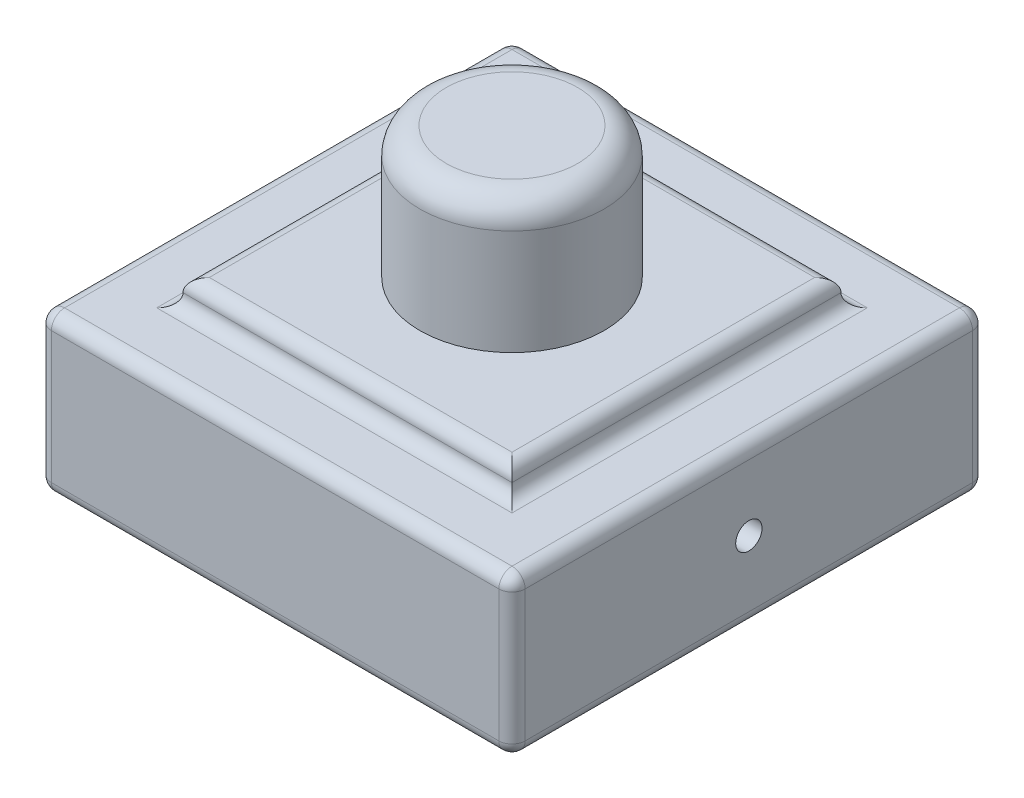
ISO-10303-21;
HEADER;
FILE_DESCRIPTION(('STEP AP214'),'2;1');
FILE_NAME('part.step','',(''),(''),'','','');
FILE_SCHEMA(('AUTOMOTIVE_DESIGN { 1 0 10303 214 1 1 1 1 }'));
ENDSEC;
DATA;
#1=APPLICATION_CONTEXT('core data for automotive mechanical design processes');
#2=APPLICATION_PROTOCOL_DEFINITION('international standard','automotive_design',2000,#1);
#3=PRODUCT_CONTEXT('',#1,'mechanical');
#4=PRODUCT('Part','Part','',(#3));
#5=PRODUCT_RELATED_PRODUCT_CATEGORY('part','',(#4));
#6=PRODUCT_DEFINITION_FORMATION('','',#4);
#7=PRODUCT_DEFINITION_CONTEXT('part definition',#1,'design');
#8=PRODUCT_DEFINITION('design','',#6,#7);
#9=PRODUCT_DEFINITION_SHAPE('','',#8);
#10=(LENGTH_UNIT() NAMED_UNIT(*) SI_UNIT(.MILLI.,.METRE.));
#11=(NAMED_UNIT(*) PLANE_ANGLE_UNIT() SI_UNIT($,.RADIAN.));
#12=(NAMED_UNIT(*) SI_UNIT($,.STERADIAN.) SOLID_ANGLE_UNIT());
#13=UNCERTAINTY_MEASURE_WITH_UNIT(LENGTH_MEASURE(1.E-05),#10,'distance_accuracy_value','');
#14=(GEOMETRIC_REPRESENTATION_CONTEXT(3) GLOBAL_UNCERTAINTY_ASSIGNED_CONTEXT((#13)) GLOBAL_UNIT_ASSIGNED_CONTEXT((#10,
#11,#12)) REPRESENTATION_CONTEXT('',''));
#15=CARTESIAN_POINT('',(0.,0.,0.));
#16=DIRECTION('',(0.,0.,1.));
#17=DIRECTION('',(1.,0.,0.));
#18=AXIS2_PLACEMENT_3D('',#15,#16,#17);
#19=CARTESIAN_POINT('',(18.,12.,-18.));
#20=DIRECTION('',(-1.,0.,0.));
#21=DIRECTION('',(0.,0.,1.));
#22=AXIS2_PLACEMENT_3D('',#19,#20,#21);
#23=PLANE('',#22);
#24=CARTESIAN_POINT('',(18.,6.,0.));
#25=DIRECTION('',(1.,0.,0.));
#26=DIRECTION('',(0.,0.,-1.));
#27=AXIS2_PLACEMENT_3D('',#24,#25,#26);
#28=CIRCLE('',#27,1.);
#29=CARTESIAN_POINT('',(18.,6.,-1.));
#30=VERTEX_POINT('',#29);
#31=EDGE_CURVE('E843',#30,#30,#28,.T.);
#32=ORIENTED_EDGE('',*,*,#31,.F.);
#33=EDGE_LOOP('',(#32));
#34=FACE_BOUND('',#33,.T.);
#35=DIRECTION('',(0.,0.,-1.));
#36=VECTOR('',#35,1.);
#37=CARTESIAN_POINT('',(18.,11.,18.));
#38=LINE('',#37,#36);
#39=CARTESIAN_POINT('',(18.,11.,-17.));
#40=VERTEX_POINT('',#39);
#41=CARTESIAN_POINT('',(18.,11.,17.));
#42=VERTEX_POINT('',#41);
#43=EDGE_CURVE('E288',#40,#42,#38,.F.);
#44=ORIENTED_EDGE('',*,*,#43,.T.);
#45=DIRECTION('',(0.,-1.,0.));
#46=VECTOR('',#45,1.);
#47=CARTESIAN_POINT('',(18.,12.,17.));
#48=LINE('',#47,#46);
#49=CARTESIAN_POINT('',(18.,1.,17.));
#50=VERTEX_POINT('',#49);
#51=EDGE_CURVE('E291',#42,#50,#48,.T.);
#52=ORIENTED_EDGE('',*,*,#51,.T.);
#53=DIRECTION('',(0.,0.,-1.));
#54=VECTOR('',#53,1.);
#55=CARTESIAN_POINT('',(18.,1.,-18.));
#56=LINE('',#55,#54);
#57=CARTESIAN_POINT('',(18.,1.,-17.));
#58=VERTEX_POINT('',#57);
#59=EDGE_CURVE('E285',#50,#58,#56,.T.);
#60=ORIENTED_EDGE('',*,*,#59,.T.);
#61=DIRECTION('',(0.,-1.,0.));
#62=VECTOR('',#61,1.);
#63=CARTESIAN_POINT('',(18.,12.,-17.));
#64=LINE('',#63,#62);
#65=EDGE_CURVE('E282',#58,#40,#64,.F.);
#66=ORIENTED_EDGE('',*,*,#65,.T.);
#67=EDGE_LOOP('',(#44,#52,#60,#66));
#68=FACE_BOUND('',#67,.T.);
#69=ADVANCED_FACE('F39',(#34,#68),#23,.F.);
#70=CARTESIAN_POINT('',(-18.,12.,-18.));
#71=DIRECTION('',(0.,0.,1.));
#72=DIRECTION('',(1.,0.,0.));
#73=AXIS2_PLACEMENT_3D('',#70,#71,#72);
#74=PLANE('',#73);
#75=DIRECTION('',(0.,-1.,0.));
#76=VECTOR('',#75,1.);
#77=CARTESIAN_POINT('',(-17.,12.,-18.));
#78=LINE('',#77,#76);
#79=CARTESIAN_POINT('',(-17.,1.,-18.));
#80=VERTEX_POINT('',#79);
#81=CARTESIAN_POINT('',(-17.,11.,-18.));
#82=VERTEX_POINT('',#81);
#83=EDGE_CURVE('E49',#80,#82,#78,.F.);
#84=ORIENTED_EDGE('',*,*,#83,.T.);
#85=DIRECTION('',(-1.,0.,0.));
#86=VECTOR('',#85,1.);
#87=CARTESIAN_POINT('',(18.,11.,-18.));
#88=LINE('',#87,#86);
#89=CARTESIAN_POINT('',(17.,11.,-18.));
#90=VERTEX_POINT('',#89);
#91=EDGE_CURVE('E11',#82,#90,#88,.F.);
#92=ORIENTED_EDGE('',*,*,#91,.T.);
#93=DIRECTION('',(0.,-1.,0.));
#94=VECTOR('',#93,1.);
#95=CARTESIAN_POINT('',(17.,12.,-18.));
#96=LINE('',#95,#94);
#97=CARTESIAN_POINT('',(17.,1.,-18.));
#98=VERTEX_POINT('',#97);
#99=EDGE_CURVE('E321',#90,#98,#96,.T.);
#100=ORIENTED_EDGE('',*,*,#99,.T.);
#101=DIRECTION('',(-1.,0.,0.));
#102=VECTOR('',#101,1.);
#103=CARTESIAN_POINT('',(-18.,1.,-18.));
#104=LINE('',#103,#102);
#105=EDGE_CURVE('E60',#98,#80,#104,.T.);
#106=ORIENTED_EDGE('',*,*,#105,.T.);
#107=EDGE_LOOP('',(#84,#92,#100,#106));
#108=FACE_BOUND('',#107,.T.);
#109=ADVANCED_FACE('F427',(#108),#74,.F.);
#110=CARTESIAN_POINT('',(-18.,12.,-18.));
#111=DIRECTION('',(1.,0.,0.));
#112=DIRECTION('',(0.,0.,-1.));
#113=AXIS2_PLACEMENT_3D('',#110,#111,#112);
#114=PLANE('',#113);
#115=CARTESIAN_POINT('',(-18.,6.,0.));
#116=DIRECTION('',(1.,0.,0.));
#117=DIRECTION('',(0.,0.,-1.));
#118=AXIS2_PLACEMENT_3D('',#115,#116,#117);
#119=CIRCLE('',#118,1.);
#120=CARTESIAN_POINT('',(-18.,6.,-1.));
#121=VERTEX_POINT('',#120);
#122=EDGE_CURVE('E43',#121,#121,#119,.T.);
#123=ORIENTED_EDGE('',*,*,#122,.T.);
#124=EDGE_LOOP('',(#123));
#125=FACE_BOUND('',#124,.T.);
#126=DIRECTION('',(0.,0.,1.));
#127=VECTOR('',#126,1.);
#128=CARTESIAN_POINT('',(-18.,1.,-18.));
#129=LINE('',#128,#127);
#130=CARTESIAN_POINT('',(-18.,1.,-17.));
#131=VERTEX_POINT('',#130);
#132=CARTESIAN_POINT('',(-18.,1.,17.));
#133=VERTEX_POINT('',#132);
#134=EDGE_CURVE('E272',#131,#133,#129,.T.);
#135=ORIENTED_EDGE('',*,*,#134,.T.);
#136=DIRECTION('',(0.,-1.,0.));
#137=VECTOR('',#136,1.);
#138=CARTESIAN_POINT('',(-18.,12.,17.));
#139=LINE('',#138,#137);
#140=CARTESIAN_POINT('',(-18.,11.,17.));
#141=VERTEX_POINT('',#140);
#142=EDGE_CURVE('E278',#133,#141,#139,.F.);
#143=ORIENTED_EDGE('',*,*,#142,.T.);
#144=DIRECTION('',(0.,0.,1.));
#145=VECTOR('',#144,1.);
#146=CARTESIAN_POINT('',(-18.,11.,-18.));
#147=LINE('',#146,#145);
#148=CARTESIAN_POINT('',(-18.,11.,-17.));
#149=VERTEX_POINT('',#148);
#150=EDGE_CURVE('E275',#141,#149,#147,.F.);
#151=ORIENTED_EDGE('',*,*,#150,.T.);
#152=DIRECTION('',(0.,-1.,0.));
#153=VECTOR('',#152,1.);
#154=CARTESIAN_POINT('',(-18.,12.,-17.));
#155=LINE('',#154,#153);
#156=EDGE_CURVE('E269',#149,#131,#155,.T.);
#157=ORIENTED_EDGE('',*,*,#156,.T.);
#158=EDGE_LOOP('',(#135,#143,#151,#157));
#159=FACE_BOUND('',#158,.T.);
#160=ADVANCED_FACE('F489',(#125,#159),#114,.F.);
#161=CARTESIAN_POINT('',(-18.,12.,18.));
#162=DIRECTION('',(0.,0.,-1.));
#163=DIRECTION('',(-1.,0.,0.));
#164=AXIS2_PLACEMENT_3D('',#161,#162,#163);
#165=PLANE('',#164);
#166=DIRECTION('',(0.,-1.,0.));
#167=VECTOR('',#166,1.);
#168=CARTESIAN_POINT('',(-17.,12.,18.));
#169=LINE('',#168,#167);
#170=CARTESIAN_POINT('',(-17.,11.,18.));
#171=VERTEX_POINT('',#170);
#172=CARTESIAN_POINT('',(-17.,1.,18.));
#173=VERTEX_POINT('',#172);
#174=EDGE_CURVE('E262',#171,#173,#169,.T.);
#175=ORIENTED_EDGE('',*,*,#174,.T.);
#176=DIRECTION('',(1.,0.,0.));
#177=VECTOR('',#176,1.);
#178=CARTESIAN_POINT('',(-18.,1.,18.));
#179=LINE('',#178,#177);
#180=CARTESIAN_POINT('',(17.,1.,18.));
#181=VERTEX_POINT('',#180);
#182=EDGE_CURVE('E266',#173,#181,#179,.T.);
#183=ORIENTED_EDGE('',*,*,#182,.T.);
#184=DIRECTION('',(0.,-1.,0.));
#185=VECTOR('',#184,1.);
#186=CARTESIAN_POINT('',(17.,12.,18.));
#187=LINE('',#186,#185);
#188=CARTESIAN_POINT('',(17.,11.,18.));
#189=VERTEX_POINT('',#188);
#190=EDGE_CURVE('E259',#181,#189,#187,.F.);
#191=ORIENTED_EDGE('',*,*,#190,.T.);
#192=DIRECTION('',(1.,0.,0.));
#193=VECTOR('',#192,1.);
#194=CARTESIAN_POINT('',(-18.,11.,18.));
#195=LINE('',#194,#193);
#196=EDGE_CURVE('E221',#189,#171,#195,.F.);
#197=ORIENTED_EDGE('',*,*,#196,.T.);
#198=EDGE_LOOP('',(#175,#183,#191,#197));
#199=FACE_BOUND('',#198,.T.);
#200=ADVANCED_FACE('F502',(#199),#165,.F.);
#201=CARTESIAN_POINT('',(0.,12.,0.));
#202=DIRECTION('',(0.,1.,0.));
#203=DIRECTION('',(0.,0.,1.));
#204=AXIS2_PLACEMENT_3D('',#201,#202,#203);
#205=PLANE('',#204);
#206=DIRECTION('',(0.,0.,1.));
#207=VECTOR('',#206,1.);
#208=CARTESIAN_POINT('',(-17.,12.,18.));
#209=LINE('',#208,#207);
#210=CARTESIAN_POINT('',(-17.,12.,-17.));
#211=VERTEX_POINT('',#210);
#212=CARTESIAN_POINT('',(-17.,12.,17.));
#213=VERTEX_POINT('',#212);
#214=EDGE_CURVE('E314',#211,#213,#209,.T.);
#215=ORIENTED_EDGE('',*,*,#214,.T.);
#216=DIRECTION('',(1.,0.,0.));
#217=VECTOR('',#216,1.);
#218=CARTESIAN_POINT('',(18.,12.,17.));
#219=LINE('',#218,#217);
#220=CARTESIAN_POINT('',(17.,12.,17.));
#221=VERTEX_POINT('',#220);
#222=EDGE_CURVE('E317',#213,#221,#219,.T.);
#223=ORIENTED_EDGE('',*,*,#222,.T.);
#224=DIRECTION('',(0.,0.,-1.));
#225=VECTOR('',#224,1.);
#226=CARTESIAN_POINT('',(17.,12.,-18.));
#227=LINE('',#226,#225);
#228=CARTESIAN_POINT('',(17.,12.,-17.));
#229=VERTEX_POINT('',#228);
#230=EDGE_CURVE('E308',#221,#229,#227,.T.);
#231=ORIENTED_EDGE('',*,*,#230,.T.);
#232=DIRECTION('',(-1.,0.,0.));
#233=VECTOR('',#232,1.);
#234=CARTESIAN_POINT('',(-18.,12.,-17.));
#235=LINE('',#234,#233);
#236=EDGE_CURVE('E311',#229,#211,#235,.T.);
#237=ORIENTED_EDGE('',*,*,#236,.T.);
#238=EDGE_LOOP('',(#215,#223,#231,#237));
#239=FACE_BOUND('',#238,.T.);
#240=DIRECTION('',(0.,0.,1.));
#241=VECTOR('',#240,1.);
#242=CARTESIAN_POINT('',(-13.5,12.,0.));
#243=LINE('',#242,#241);
#244=CARTESIAN_POINT('',(-13.5,12.,13.5));
#245=VERTEX_POINT('',#244);
#246=CARTESIAN_POINT('',(-13.5,12.,-13.5));
#247=VERTEX_POINT('',#246);
#248=EDGE_CURVE('E168',#245,#247,#243,.F.);
#249=ORIENTED_EDGE('',*,*,#248,.T.);
#250=DIRECTION('',(-1.,0.,0.));
#251=VECTOR('',#250,1.);
#252=CARTESIAN_POINT('',(0.,12.,-13.5));
#253=LINE('',#252,#251);
#254=CARTESIAN_POINT('',(13.5,12.,-13.5));
#255=VERTEX_POINT('',#254);
#256=EDGE_CURVE('E205',#247,#255,#253,.F.);
#257=ORIENTED_EDGE('',*,*,#256,.T.);
#258=DIRECTION('',(0.,0.,-1.));
#259=VECTOR('',#258,1.);
#260=CARTESIAN_POINT('',(13.5,12.,0.));
#261=LINE('',#260,#259);
#262=CARTESIAN_POINT('',(13.5,12.,13.5));
#263=VERTEX_POINT('',#262);
#264=EDGE_CURVE('E171',#255,#263,#261,.F.);
#265=ORIENTED_EDGE('',*,*,#264,.T.);
#266=DIRECTION('',(1.,0.,0.));
#267=VECTOR('',#266,1.);
#268=CARTESIAN_POINT('',(0.,12.,13.5));
#269=LINE('',#268,#267);
#270=EDGE_CURVE('E163',#263,#245,#269,.F.);
#271=ORIENTED_EDGE('',*,*,#270,.T.);
#272=EDGE_LOOP('',(#249,#257,#265,#271));
#273=FACE_BOUND('',#272,.T.);
#274=ADVANCED_FACE('F165',(#239,#273),#205,.T.);
#275=CARTESIAN_POINT('',(0.,0.,0.));
#276=DIRECTION('',(0.,1.,0.));
#277=DIRECTION('',(0.,0.,1.));
#278=AXIS2_PLACEMENT_3D('',#275,#276,#277);
#279=PLANE('',#278);
#280=DIRECTION('',(0.,0.,-1.));
#281=VECTOR('',#280,1.);
#282=CARTESIAN_POINT('',(17.,0.,0.));
#283=LINE('',#282,#281);
#284=CARTESIAN_POINT('',(17.,0.,-17.));
#285=VERTEX_POINT('',#284);
#286=CARTESIAN_POINT('',(17.,0.,17.));
#287=VERTEX_POINT('',#286);
#288=EDGE_CURVE('E295',#285,#287,#283,.F.);
#289=ORIENTED_EDGE('',*,*,#288,.T.);
#290=DIRECTION('',(1.,0.,0.));
#291=VECTOR('',#290,1.);
#292=CARTESIAN_POINT('',(0.,0.,17.));
#293=LINE('',#292,#291);
#294=CARTESIAN_POINT('',(-17.,0.,17.));
#295=VERTEX_POINT('',#294);
#296=EDGE_CURVE('E304',#287,#295,#293,.F.);
#297=ORIENTED_EDGE('',*,*,#296,.T.);
#298=DIRECTION('',(0.,0.,1.));
#299=VECTOR('',#298,1.);
#300=CARTESIAN_POINT('',(-17.,0.,0.));
#301=LINE('',#300,#299);
#302=CARTESIAN_POINT('',(-17.,0.,-17.));
#303=VERTEX_POINT('',#302);
#304=EDGE_CURVE('E301',#295,#303,#301,.F.);
#305=ORIENTED_EDGE('',*,*,#304,.T.);
#306=DIRECTION('',(-1.,0.,0.));
#307=VECTOR('',#306,1.);
#308=CARTESIAN_POINT('',(0.,0.,-17.));
#309=LINE('',#308,#307);
#310=EDGE_CURVE('E298',#303,#285,#309,.F.);
#311=ORIENTED_EDGE('',*,*,#310,.T.);
#312=EDGE_LOOP('',(#289,#297,#305,#311));
#313=FACE_BOUND('',#312,.T.);
#314=ADVANCED_FACE('F509',(#313),#279,.F.);
#315=CARTESIAN_POINT('',(0.,14.,0.));
#316=DIRECTION('',(0.,1.,0.));
#317=DIRECTION('',(0.,0.,1.));
#318=AXIS2_PLACEMENT_3D('',#315,#316,#317);
#319=PLANE('',#318);
#320=DIRECTION('',(-1.,0.,0.));
#321=VECTOR('',#320,1.);
#322=CARTESIAN_POINT('',(-12.5,14.,-11.5));
#323=LINE('',#322,#321);
#324=CARTESIAN_POINT('',(11.5,14.,-11.5));
#325=VERTEX_POINT('',#324);
#326=CARTESIAN_POINT('',(-11.5,14.,-11.5));
#327=VERTEX_POINT('',#326);
#328=EDGE_CURVE('E208',#325,#327,#323,.T.);
#329=ORIENTED_EDGE('',*,*,#328,.T.);
#330=DIRECTION('',(0.,0.,1.));
#331=VECTOR('',#330,1.);
#332=CARTESIAN_POINT('',(-11.5,14.,12.5));
#333=LINE('',#332,#331);
#334=CARTESIAN_POINT('',(-11.5,14.,11.5));
#335=VERTEX_POINT('',#334);
#336=EDGE_CURVE('E217',#327,#335,#333,.T.);
#337=ORIENTED_EDGE('',*,*,#336,.T.);
#338=DIRECTION('',(1.,0.,0.));
#339=VECTOR('',#338,1.);
#340=CARTESIAN_POINT('',(12.5,14.,11.5));
#341=LINE('',#340,#339);
#342=CARTESIAN_POINT('',(11.5,14.,11.5));
#343=VERTEX_POINT('',#342);
#344=EDGE_CURVE('E214',#335,#343,#341,.T.);
#345=ORIENTED_EDGE('',*,*,#344,.T.);
#346=DIRECTION('',(0.,0.,-1.));
#347=VECTOR('',#346,1.);
#348=CARTESIAN_POINT('',(11.5,14.,-12.5));
#349=LINE('',#348,#347);
#350=EDGE_CURVE('E211',#343,#325,#349,.T.);
#351=ORIENTED_EDGE('',*,*,#350,.T.);
#352=EDGE_LOOP('',(#329,#337,#345,#351));
#353=FACE_BOUND('',#352,.T.);
#354=CARTESIAN_POINT('',(0.,14.,0.));
#355=DIRECTION('',(0.,1.,0.));
#356=DIRECTION('',(0.,0.,1.));
#357=AXIS2_PLACEMENT_3D('',#354,#355,#356);
#358=CIRCLE('',#357,7.);
#359=CARTESIAN_POINT('',(0.,14.,7.));
#360=VERTEX_POINT('',#359);
#361=EDGE_CURVE('E256',#360,#360,#358,.T.);
#362=ORIENTED_EDGE('',*,*,#361,.F.);
#363=EDGE_LOOP('',(#362));
#364=FACE_BOUND('',#363,.T.);
#365=ADVANCED_FACE('F654',(#353,#364),#319,.T.);
#366=CARTESIAN_POINT('',(0.,24.,0.));
#367=DIRECTION('',(0.,-1.,0.));
#368=DIRECTION('',(0.,0.,-1.));
#369=AXIS2_PLACEMENT_3D('',#366,#367,#368);
#370=CYLINDRICAL_SURFACE('',#369,7.);
#371=CARTESIAN_POINT('',(0.,22.,0.));
#372=DIRECTION('',(0.,1.,0.));
#373=DIRECTION('',(0.,0.,1.));
#374=AXIS2_PLACEMENT_3D('',#371,#372,#373);
#375=CIRCLE('',#374,7.);
#376=CARTESIAN_POINT('',(0.,22.,7.));
#377=VERTEX_POINT('',#376);
#378=EDGE_CURVE('E195',#377,#377,#375,.F.);
#379=ORIENTED_EDGE('',*,*,#378,.T.);
#380=EDGE_LOOP('',(#379));
#381=FACE_BOUND('',#380,.T.);
#382=ORIENTED_EDGE('',*,*,#361,.T.);
#383=EDGE_LOOP('',(#382));
#384=FACE_BOUND('',#383,.T.);
#385=ADVANCED_FACE('F646',(#381,#384),#370,.T.);
#386=CARTESIAN_POINT('',(0.,24.,0.));
#387=DIRECTION('',(0.,1.,0.));
#388=DIRECTION('',(0.,0.,1.));
#389=AXIS2_PLACEMENT_3D('',#386,#387,#388);
#390=PLANE('',#389);
#391=CARTESIAN_POINT('',(0.,24.,0.));
#392=DIRECTION('',(0.,1.,0.));
#393=DIRECTION('',(0.,0.,1.));
#394=AXIS2_PLACEMENT_3D('',#391,#392,#393);
#395=CIRCLE('',#394,5.);
#396=CARTESIAN_POINT('',(0.,24.,5.));
#397=VERTEX_POINT('',#396);
#398=EDGE_CURVE('E199',#397,#397,#395,.T.);
#399=ORIENTED_EDGE('',*,*,#398,.T.);
#400=EDGE_LOOP('',(#399));
#401=FACE_BOUND('',#400,.T.);
#402=ADVANCED_FACE('F527',(#401),#390,.T.);
#403=CARTESIAN_POINT('',(0.,22.,0.));
#404=DIRECTION('',(0.,1.,0.));
#405=DIRECTION('',(0.,0.,1.));
#406=AXIS2_PLACEMENT_3D('',#403,#404,#405);
#407=TOROIDAL_SURFACE('',#406,5.,2.);
#408=ORIENTED_EDGE('',*,*,#378,.F.);
#409=EDGE_LOOP('',(#408));
#410=FACE_BOUND('',#409,.T.);
#411=ORIENTED_EDGE('',*,*,#398,.F.);
#412=EDGE_LOOP('',(#411));
#413=FACE_BOUND('',#412,.T.);
#414=ADVANCED_FACE('F523',(#410,#413),#407,.T.);
#415=CARTESIAN_POINT('',(0.,13.,11.5));
#416=DIRECTION('',(-1.,0.,0.));
#417=DIRECTION('',(0.,0.,1.));
#418=AXIS2_PLACEMENT_3D('',#415,#416,#417);
#419=CYLINDRICAL_SURFACE('',#418,1.);
#420=CARTESIAN_POINT('',(11.5,13.,11.5));
#421=DIRECTION('',(-0.707106781186547,0.,0.707106781186547));
#422=DIRECTION('',(0.707106781186547,0.,0.707106781186547));
#423=AXIS2_PLACEMENT_3D('',#420,#421,#422);
#424=ELLIPSE('',#423,1.41421356237309,1.);
#425=CARTESIAN_POINT('',(12.5,13.,12.5));
#426=VERTEX_POINT('',#425);
#427=EDGE_CURVE('E253',#343,#426,#424,.F.);
#428=ORIENTED_EDGE('',*,*,#427,.F.);
#429=ORIENTED_EDGE('',*,*,#344,.F.);
#430=CARTESIAN_POINT('',(-11.5,13.,11.5));
#431=DIRECTION('',(-0.707106781186547,0.,-0.707106781186547));
#432=DIRECTION('',(-0.707106781186547,0.,0.707106781186547));
#433=AXIS2_PLACEMENT_3D('',#430,#431,#432);
#434=ELLIPSE('',#433,1.41421356237309,1.);
#435=CARTESIAN_POINT('',(-12.5,13.,12.5));
#436=VERTEX_POINT('',#435);
#437=EDGE_CURVE('E250',#436,#335,#434,.T.);
#438=ORIENTED_EDGE('',*,*,#437,.F.);
#439=DIRECTION('',(1.,0.,0.));
#440=VECTOR('',#439,1.);
#441=CARTESIAN_POINT('',(-12.5,13.,12.5));
#442=LINE('',#441,#440);
#443=EDGE_CURVE('E182',#426,#436,#442,.F.);
#444=ORIENTED_EDGE('',*,*,#443,.F.);
#445=EDGE_LOOP('',(#428,#429,#438,#444));
#446=FACE_BOUND('',#445,.T.);
#447=ADVANCED_FACE('F526',(#446),#419,.T.);
#448=CARTESIAN_POINT('',(11.5,13.,0.));
#449=DIRECTION('',(0.,0.,1.));
#450=DIRECTION('',(1.,0.,0.));
#451=AXIS2_PLACEMENT_3D('',#448,#449,#450);
#452=CYLINDRICAL_SURFACE('',#451,1.);
#453=ORIENTED_EDGE('',*,*,#350,.F.);
#454=ORIENTED_EDGE('',*,*,#427,.T.);
#455=DIRECTION('',(0.,0.,-1.));
#456=VECTOR('',#455,1.);
#457=CARTESIAN_POINT('',(12.5,13.,12.5));
#458=LINE('',#457,#456);
#459=CARTESIAN_POINT('',(12.5,13.,-12.5));
#460=VERTEX_POINT('',#459);
#461=EDGE_CURVE('E241',#460,#426,#458,.F.);
#462=ORIENTED_EDGE('',*,*,#461,.F.);
#463=CARTESIAN_POINT('',(11.5,13.,-11.5));
#464=DIRECTION('',(0.707106781186547,0.,0.707106781186547));
#465=DIRECTION('',(0.707106781186547,0.,-0.707106781186547));
#466=AXIS2_PLACEMENT_3D('',#463,#464,#465);
#467=ELLIPSE('',#466,1.41421356237309,1.);
#468=EDGE_CURVE('E237',#325,#460,#467,.F.);
#469=ORIENTED_EDGE('',*,*,#468,.F.);
#470=EDGE_LOOP('',(#453,#454,#462,#469));
#471=FACE_BOUND('',#470,.T.);
#472=ADVANCED_FACE('F548',(#471),#452,.T.);
#473=CARTESIAN_POINT('',(-11.5,13.,0.));
#474=DIRECTION('',(0.,0.,-1.));
#475=DIRECTION('',(-1.,0.,0.));
#476=AXIS2_PLACEMENT_3D('',#473,#474,#475);
#477=CYLINDRICAL_SURFACE('',#476,1.);
#478=ORIENTED_EDGE('',*,*,#437,.T.);
#479=ORIENTED_EDGE('',*,*,#336,.F.);
#480=CARTESIAN_POINT('',(-11.5,13.,-11.5));
#481=DIRECTION('',(0.707106781186547,0.,-0.707106781186547));
#482=DIRECTION('',(0.707106781186547,0.,0.707106781186547));
#483=AXIS2_PLACEMENT_3D('',#480,#481,#482);
#484=ELLIPSE('',#483,1.41421356237309,1.);
#485=CARTESIAN_POINT('',(-12.5,13.,-12.5));
#486=VERTEX_POINT('',#485);
#487=EDGE_CURVE('E233',#486,#327,#484,.T.);
#488=ORIENTED_EDGE('',*,*,#487,.F.);
#489=DIRECTION('',(0.,0.,1.));
#490=VECTOR('',#489,1.);
#491=CARTESIAN_POINT('',(-12.5,13.,-12.5));
#492=LINE('',#491,#490);
#493=EDGE_CURVE('E187',#436,#486,#492,.F.);
#494=ORIENTED_EDGE('',*,*,#493,.F.);
#495=EDGE_LOOP('',(#478,#479,#488,#494));
#496=FACE_BOUND('',#495,.T.);
#497=ADVANCED_FACE('F545',(#496),#477,.T.);
#498=CARTESIAN_POINT('',(-12.5,13.,13.5));
#499=DIRECTION('',(1.,0.,0.));
#500=DIRECTION('',(0.,0.,-1.));
#501=AXIS2_PLACEMENT_3D('',#498,#499,#500);
#502=CYLINDRICAL_SURFACE('',#501,1.);
#503=CARTESIAN_POINT('',(-13.5,13.,13.5));
#504=DIRECTION('',(0.707106781186547,0.,0.707106781186547));
#505=DIRECTION('',(-0.707106781186547,0.,0.707106781186547));
#506=AXIS2_PLACEMENT_3D('',#503,#504,#505);
#507=ELLIPSE('',#506,1.41421356237309,1.);
#508=EDGE_CURVE('E179',#245,#436,#507,.T.);
#509=ORIENTED_EDGE('',*,*,#508,.F.);
#510=ORIENTED_EDGE('',*,*,#270,.F.);
#511=CARTESIAN_POINT('',(13.5,13.,13.5));
#512=DIRECTION('',(0.707106781186547,0.,-0.707106781186547));
#513=DIRECTION('',(0.707106781186547,0.,0.707106781186547));
#514=AXIS2_PLACEMENT_3D('',#511,#512,#513);
#515=ELLIPSE('',#514,1.41421356237309,1.);
#516=EDGE_CURVE('E245',#426,#263,#515,.F.);
#517=ORIENTED_EDGE('',*,*,#516,.F.);
#518=ORIENTED_EDGE('',*,*,#443,.T.);
#519=EDGE_LOOP('',(#509,#510,#517,#518));
#520=FACE_BOUND('',#519,.T.);
#521=ADVANCED_FACE('F180',(#520),#502,.F.);
#522=CARTESIAN_POINT('',(13.5,13.,-12.5));
#523=DIRECTION('',(0.,0.,-1.));
#524=DIRECTION('',(-1.,0.,0.));
#525=AXIS2_PLACEMENT_3D('',#522,#523,#524);
#526=CYLINDRICAL_SURFACE('',#525,1.);
#527=ORIENTED_EDGE('',*,*,#516,.T.);
#528=ORIENTED_EDGE('',*,*,#264,.F.);
#529=CARTESIAN_POINT('',(13.5,13.,-13.5));
#530=DIRECTION('',(-0.707106781186547,0.,-0.707106781186547));
#531=DIRECTION('',(0.707106781186547,0.,-0.707106781186547));
#532=AXIS2_PLACEMENT_3D('',#529,#530,#531);
#533=ELLIPSE('',#532,1.41421356237309,1.);
#534=EDGE_CURVE('E188',#460,#255,#533,.F.);
#535=ORIENTED_EDGE('',*,*,#534,.F.);
#536=ORIENTED_EDGE('',*,*,#461,.T.);
#537=EDGE_LOOP('',(#527,#528,#535,#536));
#538=FACE_BOUND('',#537,.T.);
#539=ADVANCED_FACE('F538',(#538),#526,.F.);
#540=CARTESIAN_POINT('',(0.,13.,-11.5));
#541=DIRECTION('',(1.,0.,0.));
#542=DIRECTION('',(0.,0.,-1.));
#543=AXIS2_PLACEMENT_3D('',#540,#541,#542);
#544=CYLINDRICAL_SURFACE('',#543,1.);
#545=ORIENTED_EDGE('',*,*,#328,.F.);
#546=ORIENTED_EDGE('',*,*,#468,.T.);
#547=DIRECTION('',(-1.,0.,0.));
#548=VECTOR('',#547,1.);
#549=CARTESIAN_POINT('',(12.5,13.,-12.5));
#550=LINE('',#549,#548);
#551=EDGE_CURVE('E224',#486,#460,#550,.F.);
#552=ORIENTED_EDGE('',*,*,#551,.F.);
#553=ORIENTED_EDGE('',*,*,#487,.T.);
#554=EDGE_LOOP('',(#545,#546,#552,#553));
#555=FACE_BOUND('',#554,.T.);
#556=ADVANCED_FACE('F535',(#555),#544,.T.);
#557=CARTESIAN_POINT('',(-13.5,13.,-12.5));
#558=DIRECTION('',(0.,0.,1.));
#559=DIRECTION('',(1.,0.,0.));
#560=AXIS2_PLACEMENT_3D('',#557,#558,#559);
#561=CYLINDRICAL_SURFACE('',#560,1.);
#562=ORIENTED_EDGE('',*,*,#508,.T.);
#563=ORIENTED_EDGE('',*,*,#493,.T.);
#564=CARTESIAN_POINT('',(-13.5,13.,-13.5));
#565=DIRECTION('',(-0.707106781186547,0.,0.707106781186547));
#566=DIRECTION('',(0.707106781186547,0.,0.707106781186547));
#567=AXIS2_PLACEMENT_3D('',#564,#565,#566);
#568=ELLIPSE('',#567,1.41421356237309,1.);
#569=EDGE_CURVE('E193',#247,#486,#568,.T.);
#570=ORIENTED_EDGE('',*,*,#569,.F.);
#571=ORIENTED_EDGE('',*,*,#248,.F.);
#572=EDGE_LOOP('',(#562,#563,#570,#571));
#573=FACE_BOUND('',#572,.T.);
#574=ADVANCED_FACE('F191',(#573),#561,.F.);
#575=CARTESIAN_POINT('',(-12.5,13.,-13.5));
#576=DIRECTION('',(-1.,0.,0.));
#577=DIRECTION('',(0.,0.,1.));
#578=AXIS2_PLACEMENT_3D('',#575,#576,#577);
#579=CYLINDRICAL_SURFACE('',#578,1.);
#580=ORIENTED_EDGE('',*,*,#534,.T.);
#581=ORIENTED_EDGE('',*,*,#256,.F.);
#582=ORIENTED_EDGE('',*,*,#569,.T.);
#583=ORIENTED_EDGE('',*,*,#551,.T.);
#584=EDGE_LOOP('',(#580,#581,#582,#583));
#585=FACE_BOUND('',#584,.T.);
#586=ADVANCED_FACE('F529',(#585),#579,.F.);
#587=CARTESIAN_POINT('',(17.,12.,-17.));
#588=DIRECTION('',(0.,-1.,0.));
#589=DIRECTION('',(0.,0.,-1.));
#590=AXIS2_PLACEMENT_3D('',#587,#588,#589);
#591=CYLINDRICAL_SURFACE('',#590,1.);
#592=CARTESIAN_POINT('',(17.,11.,-17.));
#593=DIRECTION('',(0.,1.,0.));
#594=DIRECTION('',(0.,0.,1.));
#595=AXIS2_PLACEMENT_3D('',#592,#593,#594);
#596=CIRCLE('',#595,1.);
#597=EDGE_CURVE('E225',#40,#90,#596,.T.);
#598=ORIENTED_EDGE('',*,*,#597,.F.);
#599=ORIENTED_EDGE('',*,*,#65,.F.);
#600=CARTESIAN_POINT('',(17.,1.,-17.));
#601=DIRECTION('',(0.,-1.,0.));
#602=DIRECTION('',(0.,0.,-1.));
#603=AXIS2_PLACEMENT_3D('',#600,#601,#602);
#604=CIRCLE('',#603,1.);
#605=EDGE_CURVE('E410',#98,#58,#604,.T.);
#606=ORIENTED_EDGE('',*,*,#605,.F.);
#607=ORIENTED_EDGE('',*,*,#99,.F.);
#608=EDGE_LOOP('',(#598,#599,#606,#607));
#609=FACE_BOUND('',#608,.T.);
#610=ADVANCED_FACE('F41',(#609),#591,.T.);
#611=CARTESIAN_POINT('',(17.,11.,-17.));
#612=DIRECTION('',(0.,0.,1.));
#613=DIRECTION('',(1.,0.,0.));
#614=AXIS2_PLACEMENT_3D('',#611,#612,#613);
#615=SPHERICAL_SURFACE('',#614,1.);
#616=CARTESIAN_POINT('',(17.,11.,-17.));
#617=DIRECTION('',(0.,0.,-1.));
#618=DIRECTION('',(-1.,0.,0.));
#619=AXIS2_PLACEMENT_3D('',#616,#617,#618);
#620=CIRCLE('',#619,1.);
#621=EDGE_CURVE('E403',#40,#229,#620,.F.);
#622=ORIENTED_EDGE('',*,*,#621,.F.);
#623=ORIENTED_EDGE('',*,*,#597,.T.);
#624=CARTESIAN_POINT('',(17.,11.,-17.));
#625=DIRECTION('',(1.,0.,0.));
#626=DIRECTION('',(0.,0.,-1.));
#627=AXIS2_PLACEMENT_3D('',#624,#625,#626);
#628=CIRCLE('',#627,1.);
#629=EDGE_CURVE('E407',#229,#90,#628,.F.);
#630=ORIENTED_EDGE('',*,*,#629,.F.);
#631=EDGE_LOOP('',(#622,#623,#630));
#632=FACE_BOUND('',#631,.T.);
#633=ADVANCED_FACE('F420',(#632),#615,.T.);
#634=CARTESIAN_POINT('',(17.,1.,-17.));
#635=DIRECTION('',(0.,0.,1.));
#636=DIRECTION('',(1.,0.,0.));
#637=AXIS2_PLACEMENT_3D('',#634,#635,#636);
#638=SPHERICAL_SURFACE('',#637,1.);
#639=CARTESIAN_POINT('',(17.,1.,-17.));
#640=DIRECTION('',(1.,0.,0.));
#641=DIRECTION('',(0.,0.,-1.));
#642=AXIS2_PLACEMENT_3D('',#639,#640,#641);
#643=CIRCLE('',#642,1.);
#644=EDGE_CURVE('E395',#98,#285,#643,.F.);
#645=ORIENTED_EDGE('',*,*,#644,.F.);
#646=ORIENTED_EDGE('',*,*,#605,.T.);
#647=CARTESIAN_POINT('',(17.,1.,-17.));
#648=DIRECTION('',(0.,0.,-1.));
#649=DIRECTION('',(-1.,0.,0.));
#650=AXIS2_PLACEMENT_3D('',#647,#648,#649);
#651=CIRCLE('',#650,1.);
#652=EDGE_CURVE('E399',#285,#58,#651,.F.);
#653=ORIENTED_EDGE('',*,*,#652,.F.);
#654=EDGE_LOOP('',(#645,#646,#653));
#655=FACE_BOUND('',#654,.T.);
#656=ADVANCED_FACE('F475',(#655),#638,.T.);
#657=CARTESIAN_POINT('',(0.,11.,-17.));
#658=DIRECTION('',(1.,0.,0.));
#659=DIRECTION('',(0.,0.,-1.));
#660=AXIS2_PLACEMENT_3D('',#657,#658,#659);
#661=CYLINDRICAL_SURFACE('',#660,1.);
#662=ORIENTED_EDGE('',*,*,#629,.T.);
#663=ORIENTED_EDGE('',*,*,#91,.F.);
#664=CARTESIAN_POINT('',(-17.,11.,-17.));
#665=DIRECTION('',(-1.,0.,0.));
#666=DIRECTION('',(0.,0.,1.));
#667=AXIS2_PLACEMENT_3D('',#664,#665,#666);
#668=CIRCLE('',#667,1.);
#669=EDGE_CURVE('E387',#211,#82,#668,.T.);
#670=ORIENTED_EDGE('',*,*,#669,.F.);
#671=ORIENTED_EDGE('',*,*,#236,.F.);
#672=EDGE_LOOP('',(#662,#663,#670,#671));
#673=FACE_BOUND('',#672,.T.);
#674=ADVANCED_FACE('F431',(#673),#661,.T.);
#675=CARTESIAN_POINT('',(17.,11.,0.));
#676=DIRECTION('',(0.,0.,1.));
#677=DIRECTION('',(1.,0.,0.));
#678=AXIS2_PLACEMENT_3D('',#675,#676,#677);
#679=CYLINDRICAL_SURFACE('',#678,1.);
#680=ORIENTED_EDGE('',*,*,#621,.T.);
#681=ORIENTED_EDGE('',*,*,#230,.F.);
#682=CARTESIAN_POINT('',(17.,11.,17.));
#683=DIRECTION('',(0.,0.,1.));
#684=DIRECTION('',(1.,0.,0.));
#685=AXIS2_PLACEMENT_3D('',#682,#683,#684);
#686=CIRCLE('',#685,1.);
#687=EDGE_CURVE('E383',#42,#221,#686,.T.);
#688=ORIENTED_EDGE('',*,*,#687,.F.);
#689=ORIENTED_EDGE('',*,*,#43,.F.);
#690=EDGE_LOOP('',(#680,#681,#688,#689));
#691=FACE_BOUND('',#690,.T.);
#692=ADVANCED_FACE('F459',(#691),#679,.T.);
#693=CARTESIAN_POINT('',(17.,12.,17.));
#694=DIRECTION('',(0.,-1.,0.));
#695=DIRECTION('',(0.,0.,-1.));
#696=AXIS2_PLACEMENT_3D('',#693,#694,#695);
#697=CYLINDRICAL_SURFACE('',#696,1.);
#698=CARTESIAN_POINT('',(17.,1.,17.));
#699=DIRECTION('',(0.,-1.,0.));
#700=DIRECTION('',(0.,0.,-1.));
#701=AXIS2_PLACEMENT_3D('',#698,#699,#700);
#702=CIRCLE('',#701,1.);
#703=EDGE_CURVE('E375',#50,#181,#702,.T.);
#704=ORIENTED_EDGE('',*,*,#703,.F.);
#705=ORIENTED_EDGE('',*,*,#51,.F.);
#706=CARTESIAN_POINT('',(17.,11.,17.));
#707=DIRECTION('',(0.,1.,0.));
#708=DIRECTION('',(0.,0.,1.));
#709=AXIS2_PLACEMENT_3D('',#706,#707,#708);
#710=CIRCLE('',#709,1.);
#711=EDGE_CURVE('E379',#189,#42,#710,.T.);
#712=ORIENTED_EDGE('',*,*,#711,.F.);
#713=ORIENTED_EDGE('',*,*,#190,.F.);
#714=EDGE_LOOP('',(#704,#705,#712,#713));
#715=FACE_BOUND('',#714,.T.);
#716=ADVANCED_FACE('F464',(#715),#697,.T.);
#717=CARTESIAN_POINT('',(17.,1.,-18.));
#718=DIRECTION('',(0.,0.,-1.));
#719=DIRECTION('',(-1.,0.,0.));
#720=AXIS2_PLACEMENT_3D('',#717,#718,#719);
#721=CYLINDRICAL_SURFACE('',#720,1.);
#722=ORIENTED_EDGE('',*,*,#652,.T.);
#723=ORIENTED_EDGE('',*,*,#59,.F.);
#724=CARTESIAN_POINT('',(17.,1.,17.));
#725=DIRECTION('',(0.,0.,1.));
#726=DIRECTION('',(1.,0.,0.));
#727=AXIS2_PLACEMENT_3D('',#724,#725,#726);
#728=CIRCLE('',#727,1.);
#729=EDGE_CURVE('E372',#287,#50,#728,.T.);
#730=ORIENTED_EDGE('',*,*,#729,.F.);
#731=ORIENTED_EDGE('',*,*,#288,.F.);
#732=EDGE_LOOP('',(#722,#723,#730,#731));
#733=FACE_BOUND('',#732,.T.);
#734=ADVANCED_FACE('F471',(#733),#721,.T.);
#735=CARTESIAN_POINT('',(-18.,1.,-17.));
#736=DIRECTION('',(-1.,0.,0.));
#737=DIRECTION('',(0.,0.,1.));
#738=AXIS2_PLACEMENT_3D('',#735,#736,#737);
#739=CYLINDRICAL_SURFACE('',#738,1.);
#740=ORIENTED_EDGE('',*,*,#644,.T.);
#741=ORIENTED_EDGE('',*,*,#310,.F.);
#742=CARTESIAN_POINT('',(-17.,1.,-17.));
#743=DIRECTION('',(-1.,0.,0.));
#744=DIRECTION('',(0.,0.,1.));
#745=AXIS2_PLACEMENT_3D('',#742,#743,#744);
#746=CIRCLE('',#745,1.);
#747=EDGE_CURVE('E368',#80,#303,#746,.T.);
#748=ORIENTED_EDGE('',*,*,#747,.F.);
#749=ORIENTED_EDGE('',*,*,#105,.F.);
#750=EDGE_LOOP('',(#740,#741,#748,#749));
#751=FACE_BOUND('',#750,.T.);
#752=ADVANCED_FACE('F478',(#751),#739,.T.);
#753=CARTESIAN_POINT('',(-17.,12.,-17.));
#754=DIRECTION('',(0.,-1.,0.));
#755=DIRECTION('',(0.,0.,-1.));
#756=AXIS2_PLACEMENT_3D('',#753,#754,#755);
#757=CYLINDRICAL_SURFACE('',#756,1.);
#758=CARTESIAN_POINT('',(-17.,11.,-17.));
#759=DIRECTION('',(0.,1.,0.));
#760=DIRECTION('',(0.,0.,1.));
#761=AXIS2_PLACEMENT_3D('',#758,#759,#760);
#762=CIRCLE('',#761,1.);
#763=EDGE_CURVE('E391',#82,#149,#762,.T.);
#764=ORIENTED_EDGE('',*,*,#763,.F.);
#765=ORIENTED_EDGE('',*,*,#83,.F.);
#766=CARTESIAN_POINT('',(-17.,1.,-17.));
#767=DIRECTION('',(0.,-1.,0.));
#768=DIRECTION('',(0.,0.,-1.));
#769=AXIS2_PLACEMENT_3D('',#766,#767,#768);
#770=CIRCLE('',#769,1.);
#771=EDGE_CURVE('E364',#131,#80,#770,.T.);
#772=ORIENTED_EDGE('',*,*,#771,.F.);
#773=ORIENTED_EDGE('',*,*,#156,.F.);
#774=EDGE_LOOP('',(#764,#765,#772,#773));
#775=FACE_BOUND('',#774,.T.);
#776=ADVANCED_FACE('F435',(#775),#757,.T.);
#777=CARTESIAN_POINT('',(-17.,11.,-17.));
#778=DIRECTION('',(0.,0.,1.));
#779=DIRECTION('',(1.,0.,0.));
#780=AXIS2_PLACEMENT_3D('',#777,#778,#779);
#781=SPHERICAL_SURFACE('',#780,1.);
#782=ORIENTED_EDGE('',*,*,#669,.T.);
#783=ORIENTED_EDGE('',*,*,#763,.T.);
#784=CARTESIAN_POINT('',(-17.,11.,-17.));
#785=DIRECTION('',(0.,0.,-1.));
#786=DIRECTION('',(-1.,0.,0.));
#787=AXIS2_PLACEMENT_3D('',#784,#785,#786);
#788=CIRCLE('',#787,1.);
#789=EDGE_CURVE('E360',#211,#149,#788,.F.);
#790=ORIENTED_EDGE('',*,*,#789,.F.);
#791=EDGE_LOOP('',(#782,#783,#790));
#792=FACE_BOUND('',#791,.T.);
#793=ADVANCED_FACE('F439',(#792),#781,.T.);
#794=CARTESIAN_POINT('',(17.,11.,17.));
#795=DIRECTION('',(0.,0.,1.));
#796=DIRECTION('',(1.,0.,0.));
#797=AXIS2_PLACEMENT_3D('',#794,#795,#796);
#798=SPHERICAL_SURFACE('',#797,1.);
#799=ORIENTED_EDGE('',*,*,#711,.T.);
#800=ORIENTED_EDGE('',*,*,#687,.T.);
#801=CARTESIAN_POINT('',(17.,11.,17.));
#802=DIRECTION('',(1.,0.,0.));
#803=DIRECTION('',(0.,0.,-1.));
#804=AXIS2_PLACEMENT_3D('',#801,#802,#803);
#805=CIRCLE('',#804,1.);
#806=EDGE_CURVE('E357',#189,#221,#805,.F.);
#807=ORIENTED_EDGE('',*,*,#806,.F.);
#808=EDGE_LOOP('',(#799,#800,#807));
#809=FACE_BOUND('',#808,.T.);
#810=ADVANCED_FACE('F456',(#809),#798,.T.);
#811=CARTESIAN_POINT('',(17.,1.,17.));
#812=DIRECTION('',(0.,0.,1.));
#813=DIRECTION('',(1.,0.,0.));
#814=AXIS2_PLACEMENT_3D('',#811,#812,#813);
#815=SPHERICAL_SURFACE('',#814,1.);
#816=ORIENTED_EDGE('',*,*,#729,.T.);
#817=ORIENTED_EDGE('',*,*,#703,.T.);
#818=CARTESIAN_POINT('',(17.,1.,17.));
#819=DIRECTION('',(1.,0.,0.));
#820=DIRECTION('',(0.,0.,-1.));
#821=AXIS2_PLACEMENT_3D('',#818,#819,#820);
#822=CIRCLE('',#821,1.);
#823=EDGE_CURVE('E353',#287,#181,#822,.F.);
#824=ORIENTED_EDGE('',*,*,#823,.F.);
#825=EDGE_LOOP('',(#816,#817,#824));
#826=FACE_BOUND('',#825,.T.);
#827=ADVANCED_FACE('F575',(#826),#815,.T.);
#828=CARTESIAN_POINT('',(-17.,1.,-17.));
#829=DIRECTION('',(0.,0.,1.));
#830=DIRECTION('',(1.,0.,0.));
#831=AXIS2_PLACEMENT_3D('',#828,#829,#830);
#832=SPHERICAL_SURFACE('',#831,1.);
#833=ORIENTED_EDGE('',*,*,#771,.T.);
#834=ORIENTED_EDGE('',*,*,#747,.T.);
#835=CARTESIAN_POINT('',(-17.,1.,-17.));
#836=DIRECTION('',(0.,0.,-1.));
#837=DIRECTION('',(-1.,0.,0.));
#838=AXIS2_PLACEMENT_3D('',#835,#836,#837);
#839=CIRCLE('',#838,1.);
#840=EDGE_CURVE('E349',#131,#303,#839,.F.);
#841=ORIENTED_EDGE('',*,*,#840,.F.);
#842=EDGE_LOOP('',(#833,#834,#841));
#843=FACE_BOUND('',#842,.T.);
#844=ADVANCED_FACE('F481',(#843),#832,.T.);
#845=CARTESIAN_POINT('',(-17.,11.,0.));
#846=DIRECTION('',(0.,0.,-1.));
#847=DIRECTION('',(-1.,0.,0.));
#848=AXIS2_PLACEMENT_3D('',#845,#846,#847);
#849=CYLINDRICAL_SURFACE('',#848,1.);
#850=ORIENTED_EDGE('',*,*,#789,.T.);
#851=ORIENTED_EDGE('',*,*,#150,.F.);
#852=CARTESIAN_POINT('',(-17.,11.,17.));
#853=DIRECTION('',(0.,0.,1.));
#854=DIRECTION('',(1.,0.,0.));
#855=AXIS2_PLACEMENT_3D('',#852,#853,#854);
#856=CIRCLE('',#855,1.);
#857=EDGE_CURVE('E345',#213,#141,#856,.T.);
#858=ORIENTED_EDGE('',*,*,#857,.F.);
#859=ORIENTED_EDGE('',*,*,#214,.F.);
#860=EDGE_LOOP('',(#850,#851,#858,#859));
#861=FACE_BOUND('',#860,.T.);
#862=ADVANCED_FACE('F444',(#861),#849,.T.);
#863=CARTESIAN_POINT('',(0.,11.,17.));
#864=DIRECTION('',(-1.,0.,0.));
#865=DIRECTION('',(0.,0.,1.));
#866=AXIS2_PLACEMENT_3D('',#863,#864,#865);
#867=CYLINDRICAL_SURFACE('',#866,1.);
#868=ORIENTED_EDGE('',*,*,#806,.T.);
#869=ORIENTED_EDGE('',*,*,#222,.F.);
#870=CARTESIAN_POINT('',(-17.,11.,17.));
#871=DIRECTION('',(-1.,0.,0.));
#872=DIRECTION('',(0.,0.,1.));
#873=AXIS2_PLACEMENT_3D('',#870,#871,#872);
#874=CIRCLE('',#873,1.);
#875=EDGE_CURVE('E341',#171,#213,#874,.T.);
#876=ORIENTED_EDGE('',*,*,#875,.F.);
#877=ORIENTED_EDGE('',*,*,#196,.F.);
#878=EDGE_LOOP('',(#868,#869,#876,#877));
#879=FACE_BOUND('',#878,.T.);
#880=ADVANCED_FACE('F449',(#879),#867,.T.);
#881=CARTESIAN_POINT('',(-18.,1.,17.));
#882=DIRECTION('',(1.,0.,0.));
#883=DIRECTION('',(0.,0.,-1.));
#884=AXIS2_PLACEMENT_3D('',#881,#882,#883);
#885=CYLINDRICAL_SURFACE('',#884,1.);
#886=ORIENTED_EDGE('',*,*,#823,.T.);
#887=ORIENTED_EDGE('',*,*,#182,.F.);
#888=CARTESIAN_POINT('',(-17.,1.,17.));
#889=DIRECTION('',(-1.,0.,0.));
#890=DIRECTION('',(0.,0.,1.));
#891=AXIS2_PLACEMENT_3D('',#888,#889,#890);
#892=CIRCLE('',#891,1.);
#893=EDGE_CURVE('E337',#295,#173,#892,.T.);
#894=ORIENTED_EDGE('',*,*,#893,.F.);
#895=ORIENTED_EDGE('',*,*,#296,.F.);
#896=EDGE_LOOP('',(#886,#887,#894,#895));
#897=FACE_BOUND('',#896,.T.);
#898=ADVANCED_FACE('F500',(#897),#885,.T.);
#899=CARTESIAN_POINT('',(-17.,1.,-18.));
#900=DIRECTION('',(0.,0.,1.));
#901=DIRECTION('',(1.,0.,0.));
#902=AXIS2_PLACEMENT_3D('',#899,#900,#901);
#903=CYLINDRICAL_SURFACE('',#902,1.);
#904=ORIENTED_EDGE('',*,*,#840,.T.);
#905=ORIENTED_EDGE('',*,*,#304,.F.);
#906=CARTESIAN_POINT('',(-17.,1.,17.));
#907=DIRECTION('',(0.,0.,1.));
#908=DIRECTION('',(1.,0.,0.));
#909=AXIS2_PLACEMENT_3D('',#906,#907,#908);
#910=CIRCLE('',#909,1.);
#911=EDGE_CURVE('E334',#133,#295,#910,.T.);
#912=ORIENTED_EDGE('',*,*,#911,.F.);
#913=ORIENTED_EDGE('',*,*,#134,.F.);
#914=EDGE_LOOP('',(#904,#905,#912,#913));
#915=FACE_BOUND('',#914,.T.);
#916=ADVANCED_FACE('F486',(#915),#903,.T.);
#917=CARTESIAN_POINT('',(-17.,11.,17.));
#918=DIRECTION('',(0.,0.,1.));
#919=DIRECTION('',(1.,0.,0.));
#920=AXIS2_PLACEMENT_3D('',#917,#918,#919);
#921=SPHERICAL_SURFACE('',#920,1.);
#922=ORIENTED_EDGE('',*,*,#875,.T.);
#923=ORIENTED_EDGE('',*,*,#857,.T.);
#924=CARTESIAN_POINT('',(-17.,11.,17.));
#925=DIRECTION('',(0.,1.,0.));
#926=DIRECTION('',(0.,0.,1.));
#927=AXIS2_PLACEMENT_3D('',#924,#925,#926);
#928=CIRCLE('',#927,1.);
#929=EDGE_CURVE('E331',#171,#141,#928,.F.);
#930=ORIENTED_EDGE('',*,*,#929,.F.);
#931=EDGE_LOOP('',(#922,#923,#930));
#932=FACE_BOUND('',#931,.T.);
#933=ADVANCED_FACE('F561',(#932),#921,.T.);
#934=CARTESIAN_POINT('',(-17.,1.,17.));
#935=DIRECTION('',(0.,0.,1.));
#936=DIRECTION('',(1.,0.,0.));
#937=AXIS2_PLACEMENT_3D('',#934,#935,#936);
#938=SPHERICAL_SURFACE('',#937,1.);
#939=ORIENTED_EDGE('',*,*,#911,.T.);
#940=ORIENTED_EDGE('',*,*,#893,.T.);
#941=CARTESIAN_POINT('',(-17.,1.,17.));
#942=DIRECTION('',(0.,-1.,0.));
#943=DIRECTION('',(0.,0.,-1.));
#944=AXIS2_PLACEMENT_3D('',#941,#942,#943);
#945=CIRCLE('',#944,1.);
#946=EDGE_CURVE('E328',#133,#173,#945,.F.);
#947=ORIENTED_EDGE('',*,*,#946,.F.);
#948=EDGE_LOOP('',(#939,#940,#947));
#949=FACE_BOUND('',#948,.T.);
#950=ADVANCED_FACE('F495',(#949),#938,.T.);
#951=CARTESIAN_POINT('',(-17.,12.,17.));
#952=DIRECTION('',(0.,-1.,0.));
#953=DIRECTION('',(0.,0.,-1.));
#954=AXIS2_PLACEMENT_3D('',#951,#952,#953);
#955=CYLINDRICAL_SURFACE('',#954,1.);
#956=ORIENTED_EDGE('',*,*,#929,.T.);
#957=ORIENTED_EDGE('',*,*,#142,.F.);
#958=ORIENTED_EDGE('',*,*,#946,.T.);
#959=ORIENTED_EDGE('',*,*,#174,.F.);
#960=EDGE_LOOP('',(#956,#957,#958,#959));
#961=FACE_BOUND('',#960,.T.);
#962=ADVANCED_FACE('F492',(#961),#955,.T.);
#963=CARTESIAN_POINT('',(-32.,6.,0.));
#964=DIRECTION('',(1.,0.,0.));
#965=DIRECTION('',(0.,0.,-1.));
#966=AXIS2_PLACEMENT_3D('',#963,#964,#965);
#967=CYLINDRICAL_SURFACE('',#966,1.);
#968=ORIENTED_EDGE('',*,*,#31,.T.);
#969=EDGE_LOOP('',(#968));
#970=FACE_BOUND('',#969,.T.);
#971=ORIENTED_EDGE('',*,*,#122,.F.);
#972=EDGE_LOOP('',(#971));
#973=FACE_BOUND('',#972,.T.);
#974=ADVANCED_FACE('F558',(#970,#973),#967,.F.);
#975=CLOSED_SHELL('',(#69,#109,#160,#200,#274,#314,#365,#385,#402,#414,#447,#472,#497,#521,#539,
#556,#574,#586,#610,#633,#656,#674,#692,#716,#734,#752,#776,#793,#810,#827,#844,#862,#880,#898,
#916,#933,#950,#962,#974));
#976=MANIFOLD_SOLID_BREP('B2',#975);
#977=ADVANCED_BREP_SHAPE_REPRESENTATION('',(#18,#976),#14);
#978=SHAPE_DEFINITION_REPRESENTATION(#9,#977);
ENDSEC;
END-ISO-10303-21;
